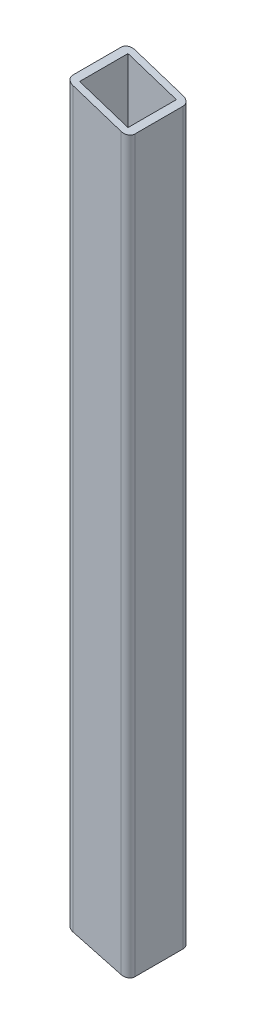
ISO-10303-21;
HEADER;
FILE_DESCRIPTION(('STEP AP214'),'2;1');
FILE_NAME('part.step','',(''),(''),'','','');
FILE_SCHEMA(('AUTOMOTIVE_DESIGN { 1 0 10303 214 1 1 1 1 }'));
ENDSEC;
DATA;
#1=APPLICATION_CONTEXT('core data for automotive mechanical design processes');
#2=APPLICATION_PROTOCOL_DEFINITION('international standard','automotive_design',2000,#1);
#3=PRODUCT_CONTEXT('',#1,'mechanical');
#4=PRODUCT('Part','Part','',(#3));
#5=PRODUCT_RELATED_PRODUCT_CATEGORY('part','',(#4));
#6=PRODUCT_DEFINITION_FORMATION('','',#4);
#7=PRODUCT_DEFINITION_CONTEXT('part definition',#1,'design');
#8=PRODUCT_DEFINITION('design','',#6,#7);
#9=PRODUCT_DEFINITION_SHAPE('','',#8);
#10=(LENGTH_UNIT() NAMED_UNIT(*) SI_UNIT(.MILLI.,.METRE.));
#11=(NAMED_UNIT(*) PLANE_ANGLE_UNIT() SI_UNIT($,.RADIAN.));
#12=(NAMED_UNIT(*) SI_UNIT($,.STERADIAN.) SOLID_ANGLE_UNIT());
#13=UNCERTAINTY_MEASURE_WITH_UNIT(LENGTH_MEASURE(1.E-05),#10,'distance_accuracy_value','');
#14=(GEOMETRIC_REPRESENTATION_CONTEXT(3) GLOBAL_UNCERTAINTY_ASSIGNED_CONTEXT((#13)) GLOBAL_UNIT_ASSIGNED_CONTEXT((#10,
#11,#12)) REPRESENTATION_CONTEXT('',''));
#15=CARTESIAN_POINT('',(0.,0.,0.));
#16=DIRECTION('',(0.,0.,1.));
#17=DIRECTION('',(1.,0.,0.));
#18=AXIS2_PLACEMENT_3D('',#15,#16,#17);
#19=CARTESIAN_POINT('',(22.8,310.,2.8));
#20=DIRECTION('',(0.,-1.,0.));
#21=DIRECTION('',(0.,0.,-1.));
#22=AXIS2_PLACEMENT_3D('',#19,#20,#21);
#23=CYLINDRICAL_SURFACE('',#22,2.8);
#24=CARTESIAN_POINT('',(22.8,0.750257738807159,2.8));
#25=DIRECTION('',(-0.258819045102513,-0.96592582628907,0.));
#26=DIRECTION('',(0.96592582628907,-0.258819045102513,0.));
#27=AXIS2_PLACEMENT_3D('',#24,#25,#26);
#28=ELLIPSE('',#27,2.89877330514823,2.8);
#29=CARTESIAN_POINT('',(22.8,0.750257738807124,0.));
#30=VERTEX_POINT('',#29);
#31=CARTESIAN_POINT('',(25.6,0.,2.80000000000002));
#32=VERTEX_POINT('',#31);
#33=EDGE_CURVE('E129',#30,#32,#28,.T.);
#34=ORIENTED_EDGE('',*,*,#33,.F.);
#35=DIRECTION('',(0.,-1.,0.));
#36=VECTOR('',#35,1.);
#37=CARTESIAN_POINT('',(22.8,310.,0.));
#38=LINE('',#37,#36);
#39=CARTESIAN_POINT('',(22.8,302.59183092589,0.));
#40=VERTEX_POINT('',#39);
#41=EDGE_CURVE('E40',#40,#30,#38,.T.);
#42=ORIENTED_EDGE('',*,*,#41,.F.);
#43=CARTESIAN_POINT('',(22.8,302.59183092589,2.8));
#44=DIRECTION('',(0.309016994374948,0.951056516295153,0.));
#45=DIRECTION('',(0.951056516295154,-0.309016994374948,0.));
#46=AXIS2_PLACEMENT_3D('',#43,#44,#45);
#47=ELLIPSE('',#46,2.94409422786715,2.8);
#48=CARTESIAN_POINT('',(25.6,301.682055776438,2.80000000000002));
#49=VERTEX_POINT('',#48);
#50=EDGE_CURVE('E178',#49,#40,#47,.T.);
#51=ORIENTED_EDGE('',*,*,#50,.F.);
#52=DIRECTION('',(0.,-1.,0.));
#53=VECTOR('',#52,1.);
#54=CARTESIAN_POINT('',(25.6,310.,2.80000000000002));
#55=LINE('',#54,#53);
#56=EDGE_CURVE('E151',#49,#32,#55,.T.);
#57=ORIENTED_EDGE('',*,*,#56,.T.);
#58=EDGE_LOOP('',(#34,#42,#51,#57));
#59=FACE_BOUND('',#58,.T.);
#60=ADVANCED_FACE('F33',(#59),#23,.T.);
#61=CARTESIAN_POINT('',(2.80000000000002,310.,0.));
#62=DIRECTION('',(0.,0.,1.));
#63=DIRECTION('',(1.,0.,0.));
#64=AXIS2_PLACEMENT_3D('',#61,#62,#63);
#65=PLANE('',#64);
#66=DIRECTION('',(0.96592582628907,-0.258819045102513,0.));
#67=VECTOR('',#66,1.);
#68=CARTESIAN_POINT('',(-73.1726896031406,26.4660624134107,0.));
#69=LINE('',#68,#67);
#70=CARTESIAN_POINT('',(2.80000000000002,6.10924158742943,0.));
#71=VERTEX_POINT('',#70);
#72=EDGE_CURVE('E173',#71,#30,#69,.T.);
#73=ORIENTED_EDGE('',*,*,#72,.F.);
#74=DIRECTION('',(0.,-1.,0.));
#75=VECTOR('',#74,1.);
#76=CARTESIAN_POINT('',(2.80000000000002,310.,0.));
#77=LINE('',#76,#75);
#78=CARTESIAN_POINT('',(2.80000000000002,309.090224850548,0.));
#79=VERTEX_POINT('',#78);
#80=EDGE_CURVE('E165',#79,#71,#77,.T.);
#81=ORIENTED_EDGE('',*,*,#80,.F.);
#82=DIRECTION('',(-0.951056516295154,0.309016994374948,0.));
#83=VECTOR('',#82,1.);
#84=CARTESIAN_POINT('',(2.53262379212494,309.177100646791,0.));
#85=LINE('',#84,#83);
#86=EDGE_CURVE('E175',#40,#79,#85,.T.);
#87=ORIENTED_EDGE('',*,*,#86,.F.);
#88=ORIENTED_EDGE('',*,*,#41,.T.);
#89=EDGE_LOOP('',(#73,#81,#87,#88));
#90=FACE_BOUND('',#89,.T.);
#91=ADVANCED_FACE('F171',(#90),#65,.F.);
#92=CARTESIAN_POINT('',(2.8,310.,2.8));
#93=DIRECTION('',(0.,-1.,0.));
#94=DIRECTION('',(0.,0.,-1.));
#95=AXIS2_PLACEMENT_3D('',#92,#93,#94);
#96=CYLINDRICAL_SURFACE('',#95,2.8);
#97=CARTESIAN_POINT('',(2.8,6.10924158742943,2.8));
#98=DIRECTION('',(-0.258819045102513,-0.96592582628907,0.));
#99=DIRECTION('',(0.96592582628907,-0.258819045102513,0.));
#100=AXIS2_PLACEMENT_3D('',#97,#98,#99);
#101=ELLIPSE('',#100,2.89877330514823,2.8);
#102=CARTESIAN_POINT('',(0.,6.85949932623653,2.80000000000002));
#103=VERTEX_POINT('',#102);
#104=EDGE_CURVE('E226',#103,#71,#101,.T.);
#105=ORIENTED_EDGE('',*,*,#104,.F.);
#106=DIRECTION('',(0.,-1.,0.));
#107=VECTOR('',#106,1.);
#108=CARTESIAN_POINT('',(0.,310.,2.80000000000002));
#109=LINE('',#108,#107);
#110=CARTESIAN_POINT('',(0.,310.,2.80000000000002));
#111=VERTEX_POINT('',#110);
#112=EDGE_CURVE('E162',#111,#103,#109,.T.);
#113=ORIENTED_EDGE('',*,*,#112,.F.);
#114=CARTESIAN_POINT('',(2.8,309.090224850548,2.8));
#115=DIRECTION('',(0.309016994374948,0.951056516295153,0.));
#116=DIRECTION('',(0.951056516295154,-0.309016994374948,0.));
#117=AXIS2_PLACEMENT_3D('',#114,#115,#116);
#118=ELLIPSE('',#117,2.94409422786715,2.8);
#119=EDGE_CURVE('E186',#79,#111,#118,.T.);
#120=ORIENTED_EDGE('',*,*,#119,.F.);
#121=ORIENTED_EDGE('',*,*,#80,.T.);
#122=EDGE_LOOP('',(#105,#113,#120,#121));
#123=FACE_BOUND('',#122,.T.);
#124=ADVANCED_FACE('F240',(#123),#96,.T.);
#125=CARTESIAN_POINT('',(2.8,310.,22.8));
#126=DIRECTION('',(0.,-1.,0.));
#127=DIRECTION('',(0.,0.,-1.));
#128=AXIS2_PLACEMENT_3D('',#125,#126,#127);
#129=CYLINDRICAL_SURFACE('',#128,2.8);
#130=CARTESIAN_POINT('',(2.8,6.10924158742943,22.8));
#131=DIRECTION('',(-0.258819045102513,-0.96592582628907,0.));
#132=DIRECTION('',(0.96592582628907,-0.258819045102513,0.));
#133=AXIS2_PLACEMENT_3D('',#130,#131,#132);
#134=ELLIPSE('',#133,2.89877330514823,2.8);
#135=CARTESIAN_POINT('',(2.80000000000002,6.1092415874294,25.6));
#136=VERTEX_POINT('',#135);
#137=CARTESIAN_POINT('',(0.,6.85949932623653,22.8));
#138=VERTEX_POINT('',#137);
#139=EDGE_CURVE('E228',#136,#138,#134,.T.);
#140=ORIENTED_EDGE('',*,*,#139,.F.);
#141=DIRECTION('',(0.,-1.,0.));
#142=VECTOR('',#141,1.);
#143=CARTESIAN_POINT('',(2.80000000000002,310.,25.6));
#144=LINE('',#143,#142);
#145=CARTESIAN_POINT('',(2.80000000000002,309.090224850548,25.6));
#146=VERTEX_POINT('',#145);
#147=EDGE_CURVE('E153',#146,#136,#144,.T.);
#148=ORIENTED_EDGE('',*,*,#147,.F.);
#149=CARTESIAN_POINT('',(2.8,309.090224850548,22.8));
#150=DIRECTION('',(0.309016994374948,0.951056516295153,0.));
#151=DIRECTION('',(0.951056516295154,-0.309016994374948,0.));
#152=AXIS2_PLACEMENT_3D('',#149,#150,#151);
#153=ELLIPSE('',#152,2.94409422786715,2.8);
#154=CARTESIAN_POINT('',(0.,310.,22.8));
#155=VERTEX_POINT('',#154);
#156=EDGE_CURVE('E199',#155,#146,#153,.T.);
#157=ORIENTED_EDGE('',*,*,#156,.F.);
#158=DIRECTION('',(0.,-1.,0.));
#159=VECTOR('',#158,1.);
#160=CARTESIAN_POINT('',(0.,310.,22.8));
#161=LINE('',#160,#159);
#162=EDGE_CURVE('E159',#155,#138,#161,.T.);
#163=ORIENTED_EDGE('',*,*,#162,.T.);
#164=EDGE_LOOP('',(#140,#148,#157,#163));
#165=FACE_BOUND('',#164,.T.);
#166=ADVANCED_FACE('F207',(#165),#129,.T.);
#167=CARTESIAN_POINT('',(2.80000000000002,310.,25.6));
#168=DIRECTION('',(0.,0.,-1.));
#169=DIRECTION('',(-1.,0.,0.));
#170=AXIS2_PLACEMENT_3D('',#167,#168,#169);
#171=PLANE('',#170);
#172=DIRECTION('',(-0.96592582628907,0.258819045102513,0.));
#173=VECTOR('',#172,1.);
#174=CARTESIAN_POINT('',(-73.1726896031406,26.4660624134107,25.6));
#175=LINE('',#174,#173);
#176=CARTESIAN_POINT('',(22.8,0.750257738807159,25.6));
#177=VERTEX_POINT('',#176);
#178=EDGE_CURVE('E145',#177,#136,#175,.T.);
#179=ORIENTED_EDGE('',*,*,#178,.F.);
#180=DIRECTION('',(0.,-1.,0.));
#181=VECTOR('',#180,1.);
#182=CARTESIAN_POINT('',(22.8,310.,25.6));
#183=LINE('',#182,#181);
#184=CARTESIAN_POINT('',(22.8,302.59183092589,25.6));
#185=VERTEX_POINT('',#184);
#186=EDGE_CURVE('E144',#185,#177,#183,.T.);
#187=ORIENTED_EDGE('',*,*,#186,.F.);
#188=DIRECTION('',(0.951056516295154,-0.309016994374948,0.));
#189=VECTOR('',#188,1.);
#190=CARTESIAN_POINT('',(2.53262379212494,309.177100646791,25.6));
#191=LINE('',#190,#189);
#192=EDGE_CURVE('E208',#146,#185,#191,.T.);
#193=ORIENTED_EDGE('',*,*,#192,.F.);
#194=ORIENTED_EDGE('',*,*,#147,.T.);
#195=EDGE_LOOP('',(#179,#187,#193,#194));
#196=FACE_BOUND('',#195,.T.);
#197=ADVANCED_FACE('F247',(#196),#171,.F.);
#198=CARTESIAN_POINT('',(22.8,310.,22.8));
#199=DIRECTION('',(0.,-1.,0.));
#200=DIRECTION('',(0.,0.,-1.));
#201=AXIS2_PLACEMENT_3D('',#198,#199,#200);
#202=CYLINDRICAL_SURFACE('',#201,2.8);
#203=CARTESIAN_POINT('',(22.8,0.750257738807159,22.8));
#204=DIRECTION('',(-0.258819045102513,-0.96592582628907,0.));
#205=DIRECTION('',(0.96592582628907,-0.258819045102513,0.));
#206=AXIS2_PLACEMENT_3D('',#203,#204,#205);
#207=ELLIPSE('',#206,2.89877330514823,2.8);
#208=CARTESIAN_POINT('',(25.6,0.,22.8));
#209=VERTEX_POINT('',#208);
#210=EDGE_CURVE('E126',#209,#177,#207,.T.);
#211=ORIENTED_EDGE('',*,*,#210,.F.);
#212=DIRECTION('',(0.,-1.,0.));
#213=VECTOR('',#212,1.);
#214=CARTESIAN_POINT('',(25.6,310.,22.8));
#215=LINE('',#214,#213);
#216=CARTESIAN_POINT('',(25.6,301.682055776438,22.8));
#217=VERTEX_POINT('',#216);
#218=EDGE_CURVE('E141',#217,#209,#215,.T.);
#219=ORIENTED_EDGE('',*,*,#218,.F.);
#220=CARTESIAN_POINT('',(22.8,302.59183092589,22.8));
#221=DIRECTION('',(0.309016994374948,0.951056516295153,0.));
#222=DIRECTION('',(0.951056516295154,-0.309016994374948,0.));
#223=AXIS2_PLACEMENT_3D('',#220,#221,#222);
#224=ELLIPSE('',#223,2.94409422786715,2.8);
#225=EDGE_CURVE('E210',#185,#217,#224,.T.);
#226=ORIENTED_EDGE('',*,*,#225,.F.);
#227=ORIENTED_EDGE('',*,*,#186,.T.);
#228=EDGE_LOOP('',(#211,#219,#226,#227));
#229=FACE_BOUND('',#228,.T.);
#230=ADVANCED_FACE('F140',(#229),#202,.T.);
#231=CARTESIAN_POINT('',(22.8,1040.5,2.8));
#232=DIRECTION('',(1.,0.,0.));
#233=DIRECTION('',(0.,0.,-1.));
#234=AXIS2_PLACEMENT_3D('',#231,#232,#233);
#235=PLANE('',#234);
#236=DIRECTION('',(0.,0.,-1.));
#237=VECTOR('',#236,1.);
#238=CARTESIAN_POINT('',(22.8,0.750257738806992,2.8000000000001));
#239=LINE('',#238,#237);
#240=CARTESIAN_POINT('',(22.8,0.750257738806978,22.8));
#241=VERTEX_POINT('',#240);
#242=CARTESIAN_POINT('',(22.8,0.750257738806992,2.8));
#243=VERTEX_POINT('',#242);
#244=EDGE_CURVE('E146',#241,#243,#239,.T.);
#245=ORIENTED_EDGE('',*,*,#244,.F.);
#246=DIRECTION('',(0.,-1.,0.));
#247=VECTOR('',#246,1.);
#248=CARTESIAN_POINT('',(22.8,1040.5,22.8));
#249=LINE('',#248,#247);
#250=CARTESIAN_POINT('',(22.8,302.59183092589,22.8));
#251=VERTEX_POINT('',#250);
#252=EDGE_CURVE('E182',#251,#241,#249,.T.);
#253=ORIENTED_EDGE('',*,*,#252,.F.);
#254=DIRECTION('',(0.,0.,1.));
#255=VECTOR('',#254,1.);
#256=CARTESIAN_POINT('',(22.8,302.59183092589,2.80000000000008));
#257=LINE('',#256,#255);
#258=CARTESIAN_POINT('',(22.8,302.59183092589,2.8));
#259=VERTEX_POINT('',#258);
#260=EDGE_CURVE('E214',#259,#251,#257,.T.);
#261=ORIENTED_EDGE('',*,*,#260,.F.);
#262=DIRECTION('',(0.,-1.,0.));
#263=VECTOR('',#262,1.);
#264=CARTESIAN_POINT('',(22.8,1040.5,2.8));
#265=LINE('',#264,#263);
#266=EDGE_CURVE('E135',#259,#243,#265,.T.);
#267=ORIENTED_EDGE('',*,*,#266,.T.);
#268=EDGE_LOOP('',(#245,#253,#261,#267));
#269=FACE_BOUND('',#268,.T.);
#270=ADVANCED_FACE('F286',(#269),#235,.F.);
#271=CARTESIAN_POINT('',(2.8,1040.5,2.8));
#272=DIRECTION('',(0.,0.,-1.));
#273=DIRECTION('',(-1.,0.,0.));
#274=AXIS2_PLACEMENT_3D('',#271,#272,#273);
#275=PLANE('',#274);
#276=DIRECTION('',(-0.96592582628907,0.258819045102513,0.));
#277=VECTOR('',#276,1.);
#278=CARTESIAN_POINT('',(-255.797689603136,75.4002836811415,2.79999999999996));
#279=LINE('',#278,#277);
#280=CARTESIAN_POINT('',(2.8,6.10924158742931,2.8));
#281=VERTEX_POINT('',#280);
#282=EDGE_CURVE('E47',#243,#281,#279,.T.);
#283=ORIENTED_EDGE('',*,*,#282,.F.);
#284=ORIENTED_EDGE('',*,*,#266,.F.);
#285=DIRECTION('',(0.951056516295154,-0.309016994374948,0.));
#286=VECTOR('',#285,1.);
#287=CARTESIAN_POINT('',(-212.155939607701,378.933643451341,2.79999999999996));
#288=LINE('',#287,#286);
#289=CARTESIAN_POINT('',(2.8,309.090224850548,2.8));
#290=VERTEX_POINT('',#289);
#291=EDGE_CURVE('E217',#290,#259,#288,.T.);
#292=ORIENTED_EDGE('',*,*,#291,.F.);
#293=DIRECTION('',(0.,-1.,0.));
#294=VECTOR('',#293,1.);
#295=CARTESIAN_POINT('',(2.8,1040.5,2.8));
#296=LINE('',#295,#294);
#297=EDGE_CURVE('E191',#290,#281,#296,.T.);
#298=ORIENTED_EDGE('',*,*,#297,.T.);
#299=EDGE_LOOP('',(#283,#284,#292,#298));
#300=FACE_BOUND('',#299,.T.);
#301=ADVANCED_FACE('F295',(#300),#275,.F.);
#302=CARTESIAN_POINT('',(2.8,1040.5,2.8));
#303=DIRECTION('',(-1.,0.,0.));
#304=DIRECTION('',(0.,0.,1.));
#305=AXIS2_PLACEMENT_3D('',#302,#303,#304);
#306=PLANE('',#305);
#307=DIRECTION('',(0.,0.,1.));
#308=VECTOR('',#307,1.);
#309=CARTESIAN_POINT('',(2.8,6.10924158742931,2.80000000000009));
#310=LINE('',#309,#308);
#311=CARTESIAN_POINT('',(2.79999999999998,6.10924158742929,22.8));
#312=VERTEX_POINT('',#311);
#313=EDGE_CURVE('E55',#281,#312,#310,.T.);
#314=ORIENTED_EDGE('',*,*,#313,.F.);
#315=ORIENTED_EDGE('',*,*,#297,.F.);
#316=DIRECTION('',(0.,0.,-1.));
#317=VECTOR('',#316,1.);
#318=CARTESIAN_POINT('',(2.8,309.090224850548,2.80000000000007));
#319=LINE('',#318,#317);
#320=CARTESIAN_POINT('',(2.80000000000002,309.090224850548,22.8));
#321=VERTEX_POINT('',#320);
#322=EDGE_CURVE('E220',#321,#290,#319,.T.);
#323=ORIENTED_EDGE('',*,*,#322,.F.);
#324=DIRECTION('',(0.,-1.,0.));
#325=VECTOR('',#324,1.);
#326=CARTESIAN_POINT('',(2.8,1040.5,22.8));
#327=LINE('',#326,#325);
#328=EDGE_CURVE('E184',#321,#312,#327,.T.);
#329=ORIENTED_EDGE('',*,*,#328,.T.);
#330=EDGE_LOOP('',(#314,#315,#323,#329));
#331=FACE_BOUND('',#330,.T.);
#332=ADVANCED_FACE('F305',(#331),#306,.F.);
#333=CARTESIAN_POINT('',(2.8,1040.5,22.8));
#334=DIRECTION('',(0.,0.,1.));
#335=DIRECTION('',(1.,0.,0.));
#336=AXIS2_PLACEMENT_3D('',#333,#334,#335);
#337=PLANE('',#336);
#338=DIRECTION('',(0.96592582628907,-0.258819045102513,0.));
#339=VECTOR('',#338,1.);
#340=CARTESIAN_POINT('',(-255.797689603136,75.4002836811415,22.8));
#341=LINE('',#340,#339);
#342=EDGE_CURVE('E235',#312,#241,#341,.T.);
#343=ORIENTED_EDGE('',*,*,#342,.F.);
#344=ORIENTED_EDGE('',*,*,#328,.F.);
#345=DIRECTION('',(-0.951056516295154,0.309016994374948,0.));
#346=VECTOR('',#345,1.);
#347=CARTESIAN_POINT('',(-212.155939607701,378.933643451341,22.8));
#348=LINE('',#347,#346);
#349=EDGE_CURVE('E11',#251,#321,#348,.T.);
#350=ORIENTED_EDGE('',*,*,#349,.F.);
#351=ORIENTED_EDGE('',*,*,#252,.T.);
#352=EDGE_LOOP('',(#343,#344,#350,#351));
#353=FACE_BOUND('',#352,.T.);
#354=ADVANCED_FACE('F314',(#353),#337,.F.);
#355=CARTESIAN_POINT('',(0.,310.,2.80000000000002));
#356=DIRECTION('',(1.,0.,0.));
#357=DIRECTION('',(0.,0.,-1.));
#358=AXIS2_PLACEMENT_3D('',#355,#356,#357);
#359=PLANE('',#358);
#360=DIRECTION('',(0.,0.,-1.));
#361=VECTOR('',#360,1.);
#362=CARTESIAN_POINT('',(0.,6.85949932623653,437.933630952267));
#363=LINE('',#362,#361);
#364=EDGE_CURVE('E203',#138,#103,#363,.T.);
#365=ORIENTED_EDGE('',*,*,#364,.F.);
#366=ORIENTED_EDGE('',*,*,#162,.F.);
#367=DIRECTION('',(0.,0.,1.));
#368=VECTOR('',#367,1.);
#369=CARTESIAN_POINT('',(0.,310.,2.80000000000002));
#370=LINE('',#369,#368);
#371=EDGE_CURVE('E134',#111,#155,#370,.T.);
#372=ORIENTED_EDGE('',*,*,#371,.F.);
#373=ORIENTED_EDGE('',*,*,#112,.T.);
#374=EDGE_LOOP('',(#365,#366,#372,#373));
#375=FACE_BOUND('',#374,.T.);
#376=ADVANCED_FACE('F202',(#375),#359,.F.);
#377=CARTESIAN_POINT('',(25.6,310.,2.80000000000002));
#378=DIRECTION('',(-1.,0.,0.));
#379=DIRECTION('',(0.,0.,1.));
#380=AXIS2_PLACEMENT_3D('',#377,#378,#379);
#381=PLANE('',#380);
#382=DIRECTION('',(0.,0.,-1.));
#383=VECTOR('',#382,1.);
#384=CARTESIAN_POINT('',(25.6,301.682055776438,441.433630952267));
#385=LINE('',#384,#383);
#386=EDGE_CURVE('E150',#217,#49,#385,.T.);
#387=ORIENTED_EDGE('',*,*,#386,.F.);
#388=ORIENTED_EDGE('',*,*,#218,.T.);
#389=DIRECTION('',(0.,0.,-1.));
#390=VECTOR('',#389,1.);
#391=CARTESIAN_POINT('',(25.6,0.,2.80000000000002));
#392=LINE('',#391,#390);
#393=EDGE_CURVE('E123',#209,#32,#392,.T.);
#394=ORIENTED_EDGE('',*,*,#393,.T.);
#395=ORIENTED_EDGE('',*,*,#56,.F.);
#396=EDGE_LOOP('',(#387,#388,#394,#395));
#397=FACE_BOUND('',#396,.T.);
#398=ADVANCED_FACE('F148',(#397),#381,.F.);
#399=CARTESIAN_POINT('',(0.,310.,441.433630952267));
#400=DIRECTION('',(0.309016994374948,0.951056516295153,0.));
#401=DIRECTION('',(-0.951056516295154,0.309016994374948,0.));
#402=AXIS2_PLACEMENT_3D('',#399,#400,#401);
#403=PLANE('',#402);
#404=ORIENTED_EDGE('',*,*,#291,.T.);
#405=ORIENTED_EDGE('',*,*,#260,.T.);
#406=ORIENTED_EDGE('',*,*,#349,.T.);
#407=ORIENTED_EDGE('',*,*,#322,.T.);
#408=EDGE_LOOP('',(#404,#405,#406,#407));
#409=FACE_BOUND('',#408,.T.);
#410=ORIENTED_EDGE('',*,*,#386,.T.);
#411=ORIENTED_EDGE('',*,*,#50,.T.);
#412=ORIENTED_EDGE('',*,*,#86,.T.);
#413=ORIENTED_EDGE('',*,*,#119,.T.);
#414=ORIENTED_EDGE('',*,*,#371,.T.);
#415=ORIENTED_EDGE('',*,*,#156,.T.);
#416=ORIENTED_EDGE('',*,*,#192,.T.);
#417=ORIENTED_EDGE('',*,*,#225,.T.);
#418=EDGE_LOOP('',(#410,#411,#412,#413,#414,#415,#416,#417));
#419=FACE_BOUND('',#418,.T.);
#420=ADVANCED_FACE('F180',(#409,#419),#403,.T.);
#421=CARTESIAN_POINT('',(25.6,0.,437.933630952267));
#422=DIRECTION('',(-0.258819045102513,-0.96592582628907,0.));
#423=DIRECTION('',(0.96592582628907,-0.258819045102513,0.));
#424=AXIS2_PLACEMENT_3D('',#421,#422,#423);
#425=PLANE('',#424);
#426=ORIENTED_EDGE('',*,*,#342,.T.);
#427=ORIENTED_EDGE('',*,*,#244,.T.);
#428=ORIENTED_EDGE('',*,*,#282,.T.);
#429=ORIENTED_EDGE('',*,*,#313,.T.);
#430=EDGE_LOOP('',(#426,#427,#428,#429));
#431=FACE_BOUND('',#430,.T.);
#432=ORIENTED_EDGE('',*,*,#72,.T.);
#433=ORIENTED_EDGE('',*,*,#33,.T.);
#434=ORIENTED_EDGE('',*,*,#393,.F.);
#435=ORIENTED_EDGE('',*,*,#210,.T.);
#436=ORIENTED_EDGE('',*,*,#178,.T.);
#437=ORIENTED_EDGE('',*,*,#139,.T.);
#438=ORIENTED_EDGE('',*,*,#364,.T.);
#439=ORIENTED_EDGE('',*,*,#104,.T.);
#440=EDGE_LOOP('',(#432,#433,#434,#435,#436,#437,#438,#439));
#441=FACE_BOUND('',#440,.T.);
#442=ADVANCED_FACE('F125',(#431,#441),#425,.T.);
#443=CLOSED_SHELL('',(#60,#91,#124,#166,#197,#230,#270,#301,#332,#354,#376,#398,#420,#442));
#444=MANIFOLD_SOLID_BREP('B2',#443);
#445=ADVANCED_BREP_SHAPE_REPRESENTATION('',(#18,#444),#14);
#446=SHAPE_DEFINITION_REPRESENTATION(#9,#445);
ENDSEC;
END-ISO-10303-21;
